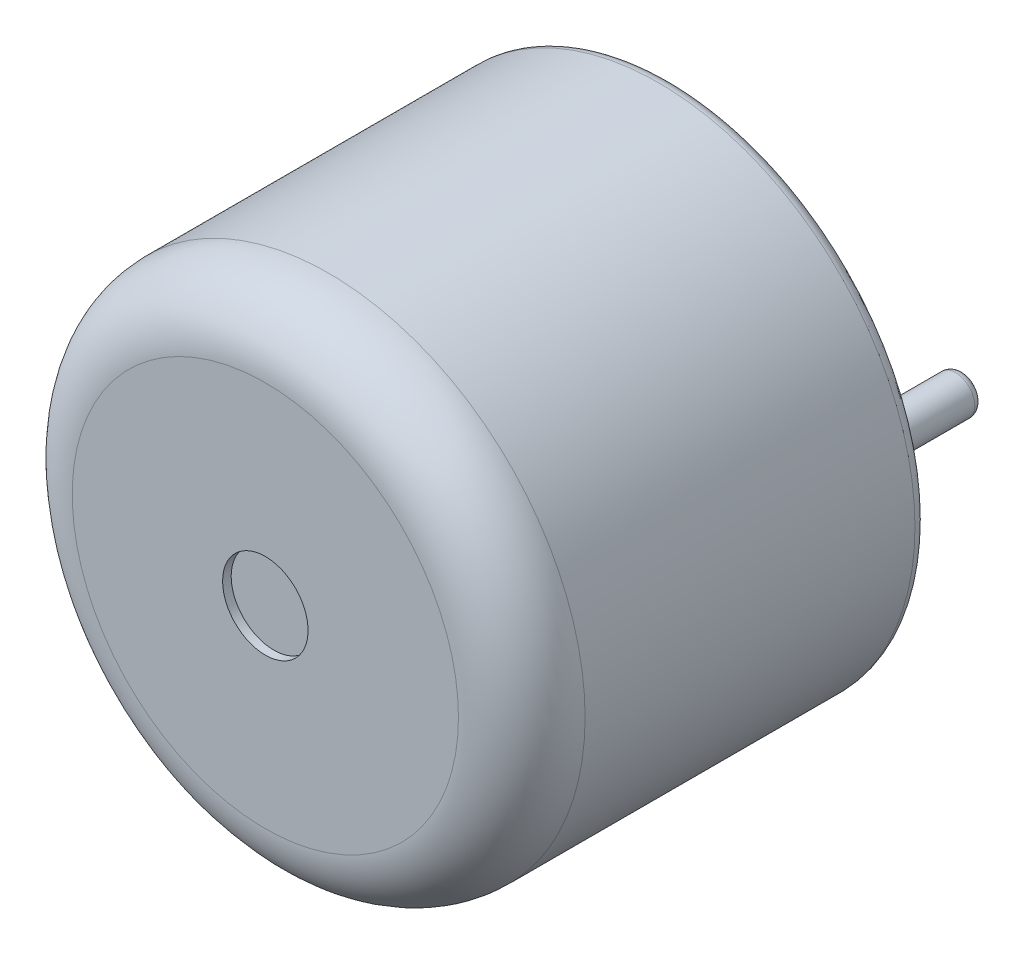
ISO-10303-21;
HEADER;
FILE_DESCRIPTION(('STEP AP214'),'2;1');
FILE_NAME('part.step','',(''),(''),'','','');
FILE_SCHEMA(('AUTOMOTIVE_DESIGN { 1 0 10303 214 1 1 1 1 }'));
ENDSEC;
DATA;
#1=APPLICATION_CONTEXT('core data for automotive mechanical design processes');
#2=APPLICATION_PROTOCOL_DEFINITION('international standard','automotive_design',2000,#1);
#3=PRODUCT_CONTEXT('',#1,'mechanical');
#4=PRODUCT('Part','Part','',(#3));
#5=PRODUCT_RELATED_PRODUCT_CATEGORY('part','',(#4));
#6=PRODUCT_DEFINITION_FORMATION('','',#4);
#7=PRODUCT_DEFINITION_CONTEXT('part definition',#1,'design');
#8=PRODUCT_DEFINITION('design','',#6,#7);
#9=PRODUCT_DEFINITION_SHAPE('','',#8);
#10=(LENGTH_UNIT() NAMED_UNIT(*) SI_UNIT(.MILLI.,.METRE.));
#11=(NAMED_UNIT(*) PLANE_ANGLE_UNIT() SI_UNIT($,.RADIAN.));
#12=(NAMED_UNIT(*) SI_UNIT($,.STERADIAN.) SOLID_ANGLE_UNIT());
#13=UNCERTAINTY_MEASURE_WITH_UNIT(LENGTH_MEASURE(1.E-05),#10,'distance_accuracy_value','');
#14=(GEOMETRIC_REPRESENTATION_CONTEXT(3) GLOBAL_UNCERTAINTY_ASSIGNED_CONTEXT((#13)) GLOBAL_UNIT_ASSIGNED_CONTEXT((#10,
#11,#12)) REPRESENTATION_CONTEXT('',''));
#15=CARTESIAN_POINT('',(0.,0.,0.));
#16=DIRECTION('',(0.,0.,1.));
#17=DIRECTION('',(1.,0.,0.));
#18=AXIS2_PLACEMENT_3D('',#15,#16,#17);
#19=CARTESIAN_POINT('',(0.,0.,-3.));
#20=DIRECTION('',(0.,0.,1.));
#21=DIRECTION('',(1.,0.,0.));
#22=AXIS2_PLACEMENT_3D('',#19,#20,#21);
#23=PLANE('',#22);
#24=CARTESIAN_POINT('',(0.,0.,-3.));
#25=DIRECTION('',(0.,0.,1.));
#26=DIRECTION('',(1.,0.,0.));
#27=AXIS2_PLACEMENT_3D('',#24,#25,#26);
#28=CIRCLE('',#27,0.27);
#29=CARTESIAN_POINT('',(0.27,0.,-3.));
#30=VERTEX_POINT('',#29);
#31=EDGE_CURVE('E172',#30,#30,#28,.T.);
#32=ORIENTED_EDGE('',*,*,#31,.F.);
#33=EDGE_LOOP('',(#32));
#34=FACE_BOUND('',#33,.T.);
#35=ADVANCED_FACE('F14',(#34),#23,.F.);
#36=CARTESIAN_POINT('',(7.6,0.,-3.));
#37=DIRECTION('',(0.,0.,1.));
#38=DIRECTION('',(1.,0.,0.));
#39=AXIS2_PLACEMENT_3D('',#36,#37,#38);
#40=PLANE('',#39);
#41=CARTESIAN_POINT('',(7.6,0.,-3.));
#42=DIRECTION('',(0.,0.,1.));
#43=DIRECTION('',(1.,0.,0.));
#44=AXIS2_PLACEMENT_3D('',#41,#42,#43);
#45=CIRCLE('',#44,0.27);
#46=CARTESIAN_POINT('',(7.87,0.,-3.));
#47=VERTEX_POINT('',#46);
#48=EDGE_CURVE('E115',#47,#47,#45,.T.);
#49=ORIENTED_EDGE('',*,*,#48,.F.);
#50=EDGE_LOOP('',(#49));
#51=FACE_BOUND('',#50,.T.);
#52=ADVANCED_FACE('F119',(#51),#40,.F.);
#53=CARTESIAN_POINT('',(0.,0.,-2.82));
#54=DIRECTION('',(0.,0.,-1.));
#55=DIRECTION('',(1.,0.,0.));
#56=AXIS2_PLACEMENT_3D('',#53,#54,#55);
#57=TOROIDAL_SURFACE('',#56,0.27,0.18);
#58=CARTESIAN_POINT('',(0.,0.,-2.82));
#59=DIRECTION('',(0.,0.,1.));
#60=DIRECTION('',(1.,0.,0.));
#61=AXIS2_PLACEMENT_3D('',#58,#59,#60);
#62=CIRCLE('',#61,0.45);
#63=CARTESIAN_POINT('',(0.45,0.,-2.82));
#64=VERTEX_POINT('',#63);
#65=EDGE_CURVE('E107',#64,#64,#62,.T.);
#66=ORIENTED_EDGE('',*,*,#65,.F.);
#67=EDGE_LOOP('',(#66));
#68=FACE_BOUND('',#67,.T.);
#69=ORIENTED_EDGE('',*,*,#31,.T.);
#70=EDGE_LOOP('',(#69));
#71=FACE_BOUND('',#70,.T.);
#72=ADVANCED_FACE('F100',(#68,#71),#57,.T.);
#73=CARTESIAN_POINT('',(7.6,0.,-2.82));
#74=DIRECTION('',(0.,0.,-1.));
#75=DIRECTION('',(1.,0.,0.));
#76=AXIS2_PLACEMENT_3D('',#73,#74,#75);
#77=TOROIDAL_SURFACE('',#76,0.27,0.18);
#78=CARTESIAN_POINT('',(7.6,0.,-2.82));
#79=DIRECTION('',(0.,0.,1.));
#80=DIRECTION('',(1.,0.,0.));
#81=AXIS2_PLACEMENT_3D('',#78,#79,#80);
#82=CIRCLE('',#81,0.45);
#83=CARTESIAN_POINT('',(8.05,0.,-2.82));
#84=VERTEX_POINT('',#83);
#85=EDGE_CURVE('E159',#84,#84,#82,.T.);
#86=ORIENTED_EDGE('',*,*,#85,.F.);
#87=EDGE_LOOP('',(#86));
#88=FACE_BOUND('',#87,.T.);
#89=ORIENTED_EDGE('',*,*,#48,.T.);
#90=EDGE_LOOP('',(#89));
#91=FACE_BOUND('',#90,.T.);
#92=ADVANCED_FACE('F94',(#88,#91),#77,.T.);
#93=CARTESIAN_POINT('',(3.8,0.,9.33));
#94=DIRECTION('',(0.,0.,1.));
#95=DIRECTION('',(1.,0.,0.));
#96=AXIS2_PLACEMENT_3D('',#93,#94,#95);
#97=PLANE('',#96);
#98=CARTESIAN_POINT('',(3.8,0.,9.33));
#99=DIRECTION('',(0.,0.,-1.));
#100=DIRECTION('',(-1.,0.,0.));
#101=AXIS2_PLACEMENT_3D('',#98,#99,#100);
#102=CIRCLE('',#101,1.);
#103=CARTESIAN_POINT('',(2.8,0.,9.33));
#104=VERTEX_POINT('',#103);
#105=EDGE_CURVE('E18',#104,#104,#102,.F.);
#106=ORIENTED_EDGE('',*,*,#105,.T.);
#107=EDGE_LOOP('',(#106));
#108=FACE_BOUND('',#107,.T.);
#109=ADVANCED_FACE('F90',(#108),#97,.T.);
#110=CARTESIAN_POINT('',(0.,0.,1.03));
#111=DIRECTION('',(0.,0.,1.));
#112=DIRECTION('',(1.,0.,0.));
#113=AXIS2_PLACEMENT_3D('',#110,#111,#112);
#114=CYLINDRICAL_SURFACE('',#113,0.45);
#115=ORIENTED_EDGE('',*,*,#65,.T.);
#116=EDGE_LOOP('',(#115));
#117=FACE_BOUND('',#116,.T.);
#118=CARTESIAN_POINT('',(0.,0.,0.0300000000000001));
#119=DIRECTION('',(0.,0.,1.));
#120=DIRECTION('',(1.,0.,0.));
#121=AXIS2_PLACEMENT_3D('',#118,#119,#120);
#122=CIRCLE('',#121,0.45);
#123=CARTESIAN_POINT('',(0.45,0.,0.0300000000000001));
#124=VERTEX_POINT('',#123);
#125=EDGE_CURVE('E149',#124,#124,#122,.F.);
#126=ORIENTED_EDGE('',*,*,#125,.T.);
#127=EDGE_LOOP('',(#126));
#128=FACE_BOUND('',#127,.T.);
#129=ADVANCED_FACE('F86',(#117,#128),#114,.T.);
#130=CARTESIAN_POINT('',(7.6,0.,1.03));
#131=DIRECTION('',(0.,0.,1.));
#132=DIRECTION('',(1.,0.,0.));
#133=AXIS2_PLACEMENT_3D('',#130,#131,#132);
#134=CYLINDRICAL_SURFACE('',#133,0.45);
#135=ORIENTED_EDGE('',*,*,#85,.T.);
#136=EDGE_LOOP('',(#135));
#137=FACE_BOUND('',#136,.T.);
#138=CARTESIAN_POINT('',(7.6,0.,0.0300000000000001));
#139=DIRECTION('',(0.,0.,1.));
#140=DIRECTION('',(1.,0.,0.));
#141=AXIS2_PLACEMENT_3D('',#138,#139,#140);
#142=CIRCLE('',#141,0.45);
#143=CARTESIAN_POINT('',(8.05,0.,0.0300000000000001));
#144=VERTEX_POINT('',#143);
#145=EDGE_CURVE('E144',#144,#144,#142,.F.);
#146=ORIENTED_EDGE('',*,*,#145,.T.);
#147=EDGE_LOOP('',(#146));
#148=FACE_BOUND('',#147,.T.);
#149=ADVANCED_FACE('F82',(#137,#148),#134,.T.);
#150=CARTESIAN_POINT('',(3.8,0.,1.93));
#151=DIRECTION('',(0.,0.,-1.));
#152=DIRECTION('',(-1.,0.,0.));
#153=AXIS2_PLACEMENT_3D('',#150,#151,#152);
#154=CYLINDRICAL_SURFACE('',#153,1.);
#155=CARTESIAN_POINT('',(3.8,0.,9.53));
#156=DIRECTION('',(0.,0.,-1.));
#157=DIRECTION('',(-1.,0.,0.));
#158=AXIS2_PLACEMENT_3D('',#155,#156,#157);
#159=CIRCLE('',#158,1.);
#160=CARTESIAN_POINT('',(2.8,0.,9.53));
#161=VERTEX_POINT('',#160);
#162=EDGE_CURVE('E142',#161,#161,#159,.T.);
#163=ORIENTED_EDGE('',*,*,#162,.F.);
#164=EDGE_LOOP('',(#163));
#165=FACE_BOUND('',#164,.T.);
#166=ORIENTED_EDGE('',*,*,#105,.F.);
#167=EDGE_LOOP('',(#166));
#168=FACE_BOUND('',#167,.T.);
#169=ADVANCED_FACE('F77',(#165,#168),#154,.F.);
#170=CARTESIAN_POINT('',(3.8,0.,0.03));
#171=DIRECTION('',(0.,0.,1.));
#172=DIRECTION('',(1.,0.,0.));
#173=AXIS2_PLACEMENT_3D('',#170,#171,#172);
#174=PLANE('',#173);
#175=ORIENTED_EDGE('',*,*,#145,.F.);
#176=EDGE_LOOP('',(#175));
#177=FACE_BOUND('',#176,.T.);
#178=ORIENTED_EDGE('',*,*,#125,.F.);
#179=EDGE_LOOP('',(#178));
#180=FACE_BOUND('',#179,.T.);
#181=CARTESIAN_POINT('',(3.8,0.,0.03));
#182=DIRECTION('',(0.,0.,1.));
#183=DIRECTION('',(1.,0.,0.));
#184=AXIS2_PLACEMENT_3D('',#181,#182,#183);
#185=CIRCLE('',#184,5.7);
#186=CARTESIAN_POINT('',(9.5,0.,0.03));
#187=VERTEX_POINT('',#186);
#188=EDGE_CURVE('E61',#187,#187,#185,.T.);
#189=ORIENTED_EDGE('',*,*,#188,.F.);
#190=EDGE_LOOP('',(#189));
#191=FACE_BOUND('',#190,.T.);
#192=ADVANCED_FACE('F67',(#177,#180,#191),#174,.F.);
#193=CARTESIAN_POINT('',(3.8,0.,9.53));
#194=DIRECTION('',(0.,0.,1.));
#195=DIRECTION('',(1.,0.,0.));
#196=AXIS2_PLACEMENT_3D('',#193,#194,#195);
#197=PLANE('',#196);
#198=ORIENTED_EDGE('',*,*,#162,.T.);
#199=EDGE_LOOP('',(#198));
#200=FACE_BOUND('',#199,.T.);
#201=CARTESIAN_POINT('',(3.8,0.,9.53));
#202=DIRECTION('',(0.,0.,-1.));
#203=DIRECTION('',(1.,0.,0.));
#204=AXIS2_PLACEMENT_3D('',#201,#202,#203);
#205=CIRCLE('',#204,4.518518518519);
#206=CARTESIAN_POINT('',(8.318518518519,0.,9.53));
#207=VERTEX_POINT('',#206);
#208=EDGE_CURVE('E27',#207,#207,#205,.T.);
#209=ORIENTED_EDGE('',*,*,#208,.F.);
#210=EDGE_LOOP('',(#209));
#211=FACE_BOUND('',#210,.T.);
#212=ADVANCED_FACE('F76',(#200,#211),#197,.T.);
#213=CARTESIAN_POINT('',(3.8,0.,0.33));
#214=DIRECTION('',(0.,0.,-1.));
#215=DIRECTION('',(1.,0.,0.));
#216=AXIS2_PLACEMENT_3D('',#213,#214,#215);
#217=TOROIDAL_SURFACE('',#216,5.7,0.3);
#218=CARTESIAN_POINT('',(3.8,0.,0.33));
#219=DIRECTION('',(0.,0.,-1.));
#220=DIRECTION('',(-1.,0.,0.));
#221=AXIS2_PLACEMENT_3D('',#218,#219,#220);
#222=CIRCLE('',#221,6.);
#223=CARTESIAN_POINT('',(-2.2,0.,0.33));
#224=VERTEX_POINT('',#223);
#225=EDGE_CURVE('E22',#224,#224,#222,.F.);
#226=ORIENTED_EDGE('',*,*,#225,.F.);
#227=EDGE_LOOP('',(#226));
#228=FACE_BOUND('',#227,.T.);
#229=ORIENTED_EDGE('',*,*,#188,.T.);
#230=EDGE_LOOP('',(#229));
#231=FACE_BOUND('',#230,.T.);
#232=ADVANCED_FACE('F41',(#228,#231),#217,.T.);
#233=CARTESIAN_POINT('',(3.8,0.,8.048518518519));
#234=DIRECTION('',(0.,0.,1.));
#235=DIRECTION('',(1.,0.,0.));
#236=AXIS2_PLACEMENT_3D('',#233,#234,#235);
#237=TOROIDAL_SURFACE('',#236,4.518518518519,1.481481481481);
#238=CARTESIAN_POINT('',(3.8,0.,8.048518518519));
#239=DIRECTION('',(0.,0.,-1.));
#240=DIRECTION('',(-1.,0.,0.));
#241=AXIS2_PLACEMENT_3D('',#238,#239,#240);
#242=CIRCLE('',#241,6.);
#243=CARTESIAN_POINT('',(-2.2,0.,8.048518518519));
#244=VERTEX_POINT('',#243);
#245=EDGE_CURVE('E10',#244,#244,#242,.T.);
#246=ORIENTED_EDGE('',*,*,#245,.F.);
#247=EDGE_LOOP('',(#246));
#248=FACE_BOUND('',#247,.T.);
#249=ORIENTED_EDGE('',*,*,#208,.T.);
#250=EDGE_LOOP('',(#249));
#251=FACE_BOUND('',#250,.T.);
#252=ADVANCED_FACE('F35',(#248,#251),#237,.T.);
#253=CARTESIAN_POINT('',(3.8,0.,0.03));
#254=DIRECTION('',(0.,0.,-1.));
#255=DIRECTION('',(-1.,0.,0.));
#256=AXIS2_PLACEMENT_3D('',#253,#254,#255);
#257=CYLINDRICAL_SURFACE('',#256,6.);
#258=ORIENTED_EDGE('',*,*,#245,.T.);
#259=EDGE_LOOP('',(#258));
#260=FACE_BOUND('',#259,.T.);
#261=ORIENTED_EDGE('',*,*,#225,.T.);
#262=EDGE_LOOP('',(#261));
#263=FACE_BOUND('',#262,.T.);
#264=ADVANCED_FACE('F40',(#260,#263),#257,.T.);
#265=CLOSED_SHELL('',(#35,#52,#72,#92,#109,#129,#149,#169,#192,#212,#232,#252,#264));
#266=MANIFOLD_SOLID_BREP('B1',#265);
#267=ADVANCED_BREP_SHAPE_REPRESENTATION('',(#18,#266),#14);
#268=SHAPE_DEFINITION_REPRESENTATION(#9,#267);
ENDSEC;
END-ISO-10303-21;
